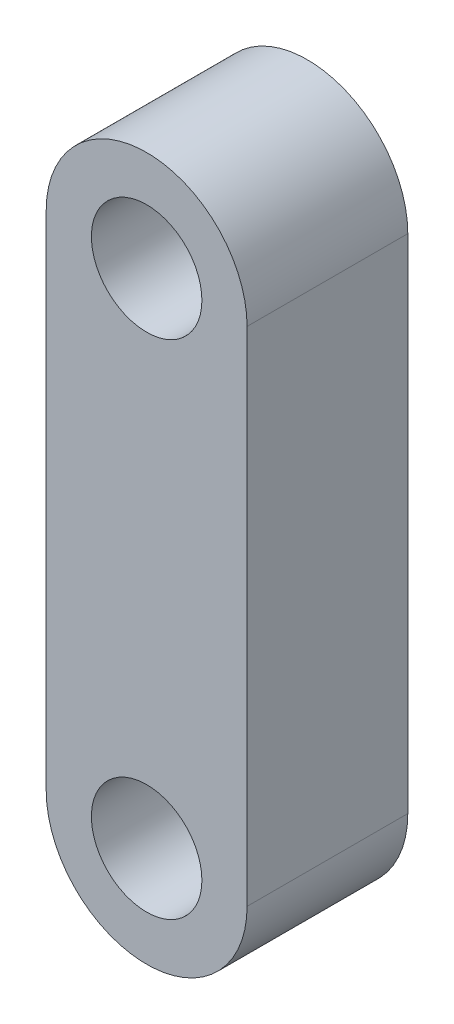
ISO-10303-21;
HEADER;
FILE_DESCRIPTION(('STEP AP214'),'2;1');
FILE_NAME('part.step','',(''),(''),'','','');
FILE_SCHEMA(('AUTOMOTIVE_DESIGN { 1 0 10303 214 1 1 1 1 }'));
ENDSEC;
DATA;
#1=APPLICATION_CONTEXT('core data for automotive mechanical design processes');
#2=APPLICATION_PROTOCOL_DEFINITION('international standard','automotive_design',2000,#1);
#3=PRODUCT_CONTEXT('',#1,'mechanical');
#4=PRODUCT('Part','Part','',(#3));
#5=PRODUCT_RELATED_PRODUCT_CATEGORY('part','',(#4));
#6=PRODUCT_DEFINITION_FORMATION('','',#4);
#7=PRODUCT_DEFINITION_CONTEXT('part definition',#1,'design');
#8=PRODUCT_DEFINITION('design','',#6,#7);
#9=PRODUCT_DEFINITION_SHAPE('','',#8);
#10=(LENGTH_UNIT() NAMED_UNIT(*) SI_UNIT(.MILLI.,.METRE.));
#11=(NAMED_UNIT(*) PLANE_ANGLE_UNIT() SI_UNIT($,.RADIAN.));
#12=(NAMED_UNIT(*) SI_UNIT($,.STERADIAN.) SOLID_ANGLE_UNIT());
#13=UNCERTAINTY_MEASURE_WITH_UNIT(LENGTH_MEASURE(1.E-05),#10,'distance_accuracy_value','');
#14=(GEOMETRIC_REPRESENTATION_CONTEXT(3) GLOBAL_UNCERTAINTY_ASSIGNED_CONTEXT((#13)) GLOBAL_UNIT_ASSIGNED_CONTEXT((#10,
#11,#12)) REPRESENTATION_CONTEXT('',''));
#15=CARTESIAN_POINT('',(0.,0.,0.));
#16=DIRECTION('',(0.,0.,1.));
#17=DIRECTION('',(1.,0.,0.));
#18=AXIS2_PLACEMENT_3D('',#15,#16,#17);
#19=CARTESIAN_POINT('',(-24.24,12.5,8.));
#20=DIRECTION('',(0.,0.,-1.));
#21=DIRECTION('',(-1.,0.,0.));
#22=AXIS2_PLACEMENT_3D('',#19,#20,#21);
#23=CYLINDRICAL_SURFACE('',#22,5.);
#24=CARTESIAN_POINT('',(-24.24,12.5,0.));
#25=DIRECTION('',(0.,0.,1.));
#26=DIRECTION('',(1.,0.,0.));
#27=AXIS2_PLACEMENT_3D('',#24,#25,#26);
#28=CIRCLE('',#27,5.);
#29=CARTESIAN_POINT('',(-19.24,12.5,0.));
#30=VERTEX_POINT('',#29);
#31=CARTESIAN_POINT('',(-29.24,12.5,0.));
#32=VERTEX_POINT('',#31);
#33=EDGE_CURVE('E113',#30,#32,#28,.T.);
#34=ORIENTED_EDGE('',*,*,#33,.T.);
#35=DIRECTION('',(0.,0.,-1.));
#36=VECTOR('',#35,1.);
#37=CARTESIAN_POINT('',(-29.24,12.5,8.));
#38=LINE('',#37,#36);
#39=CARTESIAN_POINT('',(-29.24,12.5,8.));
#40=VERTEX_POINT('',#39);
#41=EDGE_CURVE('E11',#40,#32,#38,.T.);
#42=ORIENTED_EDGE('',*,*,#41,.F.);
#43=CARTESIAN_POINT('',(-24.24,12.5,8.));
#44=DIRECTION('',(0.,0.,1.));
#45=DIRECTION('',(1.,0.,0.));
#46=AXIS2_PLACEMENT_3D('',#43,#44,#45);
#47=CIRCLE('',#46,5.);
#48=CARTESIAN_POINT('',(-19.24,12.5,8.));
#49=VERTEX_POINT('',#48);
#50=EDGE_CURVE('E97',#49,#40,#47,.T.);
#51=ORIENTED_EDGE('',*,*,#50,.F.);
#52=DIRECTION('',(0.,0.,-1.));
#53=VECTOR('',#52,1.);
#54=CARTESIAN_POINT('',(-19.24,12.5,8.));
#55=LINE('',#54,#53);
#56=EDGE_CURVE('E109',#49,#30,#55,.T.);
#57=ORIENTED_EDGE('',*,*,#56,.T.);
#58=EDGE_LOOP('',(#34,#42,#51,#57));
#59=FACE_BOUND('',#58,.T.);
#60=ADVANCED_FACE('F45',(#59),#23,.T.);
#61=CARTESIAN_POINT('',(-29.24,12.5,8.));
#62=DIRECTION('',(1.,0.,0.));
#63=DIRECTION('',(0.,0.,-1.));
#64=AXIS2_PLACEMENT_3D('',#61,#62,#63);
#65=PLANE('',#64);
#66=DIRECTION('',(0.,-1.,0.));
#67=VECTOR('',#66,1.);
#68=CARTESIAN_POINT('',(-29.24,12.5,0.));
#69=LINE('',#68,#67);
#70=CARTESIAN_POINT('',(-29.24,-12.5,0.));
#71=VERTEX_POINT('',#70);
#72=EDGE_CURVE('E102',#32,#71,#69,.T.);
#73=ORIENTED_EDGE('',*,*,#72,.T.);
#74=DIRECTION('',(0.,0.,-1.));
#75=VECTOR('',#74,1.);
#76=CARTESIAN_POINT('',(-29.24,-12.5,8.));
#77=LINE('',#76,#75);
#78=CARTESIAN_POINT('',(-29.24,-12.5,8.));
#79=VERTEX_POINT('',#78);
#80=EDGE_CURVE('E54',#79,#71,#77,.T.);
#81=ORIENTED_EDGE('',*,*,#80,.F.);
#82=DIRECTION('',(0.,-1.,0.));
#83=VECTOR('',#82,1.);
#84=CARTESIAN_POINT('',(-29.24,12.5,8.));
#85=LINE('',#84,#83);
#86=EDGE_CURVE('E92',#40,#79,#85,.T.);
#87=ORIENTED_EDGE('',*,*,#86,.F.);
#88=ORIENTED_EDGE('',*,*,#41,.T.);
#89=EDGE_LOOP('',(#73,#81,#87,#88));
#90=FACE_BOUND('',#89,.T.);
#91=ADVANCED_FACE('F101',(#90),#65,.F.);
#92=CARTESIAN_POINT('',(-24.24,-12.5,8.));
#93=DIRECTION('',(0.,0.,-1.));
#94=DIRECTION('',(-1.,0.,0.));
#95=AXIS2_PLACEMENT_3D('',#92,#93,#94);
#96=CYLINDRICAL_SURFACE('',#95,5.);
#97=CARTESIAN_POINT('',(-24.24,-12.5,0.));
#98=DIRECTION('',(0.,0.,1.));
#99=DIRECTION('',(1.,0.,0.));
#100=AXIS2_PLACEMENT_3D('',#97,#98,#99);
#101=CIRCLE('',#100,5.);
#102=CARTESIAN_POINT('',(-19.24,-12.5,0.));
#103=VERTEX_POINT('',#102);
#104=EDGE_CURVE('E79',#71,#103,#101,.T.);
#105=ORIENTED_EDGE('',*,*,#104,.T.);
#106=DIRECTION('',(0.,0.,-1.));
#107=VECTOR('',#106,1.);
#108=CARTESIAN_POINT('',(-19.24,-12.5,8.));
#109=LINE('',#108,#107);
#110=CARTESIAN_POINT('',(-19.24,-12.5,8.));
#111=VERTEX_POINT('',#110);
#112=EDGE_CURVE('E104',#111,#103,#109,.T.);
#113=ORIENTED_EDGE('',*,*,#112,.F.);
#114=CARTESIAN_POINT('',(-24.24,-12.5,8.));
#115=DIRECTION('',(0.,0.,1.));
#116=DIRECTION('',(1.,0.,0.));
#117=AXIS2_PLACEMENT_3D('',#114,#115,#116);
#118=CIRCLE('',#117,5.);
#119=EDGE_CURVE('E95',#79,#111,#118,.T.);
#120=ORIENTED_EDGE('',*,*,#119,.F.);
#121=ORIENTED_EDGE('',*,*,#80,.T.);
#122=EDGE_LOOP('',(#105,#113,#120,#121));
#123=FACE_BOUND('',#122,.T.);
#124=ADVANCED_FACE('F105',(#123),#96,.T.);
#125=CARTESIAN_POINT('',(-19.24,-12.5,8.));
#126=DIRECTION('',(-1.,0.,0.));
#127=DIRECTION('',(0.,0.,1.));
#128=AXIS2_PLACEMENT_3D('',#125,#126,#127);
#129=PLANE('',#128);
#130=DIRECTION('',(0.,1.,0.));
#131=VECTOR('',#130,1.);
#132=CARTESIAN_POINT('',(-19.24,-12.5,0.));
#133=LINE('',#132,#131);
#134=EDGE_CURVE('E85',#103,#30,#133,.T.);
#135=ORIENTED_EDGE('',*,*,#134,.T.);
#136=ORIENTED_EDGE('',*,*,#56,.F.);
#137=DIRECTION('',(0.,1.,0.));
#138=VECTOR('',#137,1.);
#139=CARTESIAN_POINT('',(-19.24,-12.5,8.));
#140=LINE('',#139,#138);
#141=EDGE_CURVE('E62',#111,#49,#140,.T.);
#142=ORIENTED_EDGE('',*,*,#141,.F.);
#143=ORIENTED_EDGE('',*,*,#112,.T.);
#144=EDGE_LOOP('',(#135,#136,#142,#143));
#145=FACE_BOUND('',#144,.T.);
#146=ADVANCED_FACE('F127',(#145),#129,.F.);
#147=CARTESIAN_POINT('',(-24.24,12.5,8.));
#148=DIRECTION('',(0.,0.,1.));
#149=DIRECTION('',(1.,0.,0.));
#150=AXIS2_PLACEMENT_3D('',#147,#148,#149);
#151=PLANE('',#150);
#152=CARTESIAN_POINT('',(-24.24,-12.5,8.));
#153=DIRECTION('',(0.,0.,1.));
#154=DIRECTION('',(1.,0.,0.));
#155=AXIS2_PLACEMENT_3D('',#152,#153,#154);
#156=CIRCLE('',#155,2.75);
#157=CARTESIAN_POINT('',(-21.49,-12.5,8.));
#158=VERTEX_POINT('',#157);
#159=EDGE_CURVE('E145',#158,#158,#156,.T.);
#160=ORIENTED_EDGE('',*,*,#159,.F.);
#161=EDGE_LOOP('',(#160));
#162=FACE_BOUND('',#161,.T.);
#163=CARTESIAN_POINT('',(-24.24,12.5,8.));
#164=DIRECTION('',(0.,0.,1.));
#165=DIRECTION('',(1.,0.,0.));
#166=AXIS2_PLACEMENT_3D('',#163,#164,#165);
#167=CIRCLE('',#166,2.75);
#168=CARTESIAN_POINT('',(-21.49,12.5,8.));
#169=VERTEX_POINT('',#168);
#170=EDGE_CURVE('E137',#169,#169,#167,.T.);
#171=ORIENTED_EDGE('',*,*,#170,.F.);
#172=EDGE_LOOP('',(#171));
#173=FACE_BOUND('',#172,.T.);
#174=ORIENTED_EDGE('',*,*,#50,.T.);
#175=ORIENTED_EDGE('',*,*,#86,.T.);
#176=ORIENTED_EDGE('',*,*,#119,.T.);
#177=ORIENTED_EDGE('',*,*,#141,.T.);
#178=EDGE_LOOP('',(#174,#175,#176,#177));
#179=FACE_BOUND('',#178,.T.);
#180=ADVANCED_FACE('F93',(#162,#173,#179),#151,.T.);
#181=CARTESIAN_POINT('',(-24.24,12.5,0.));
#182=DIRECTION('',(0.,0.,1.));
#183=DIRECTION('',(1.,0.,0.));
#184=AXIS2_PLACEMENT_3D('',#181,#182,#183);
#185=PLANE('',#184);
#186=CARTESIAN_POINT('',(-24.24,-12.5,0.));
#187=DIRECTION('',(0.,0.,1.));
#188=DIRECTION('',(1.,0.,0.));
#189=AXIS2_PLACEMENT_3D('',#186,#187,#188);
#190=CIRCLE('',#189,2.75);
#191=CARTESIAN_POINT('',(-21.49,-12.5,0.));
#192=VERTEX_POINT('',#191);
#193=EDGE_CURVE('E141',#192,#192,#190,.T.);
#194=ORIENTED_EDGE('',*,*,#193,.T.);
#195=EDGE_LOOP('',(#194));
#196=FACE_BOUND('',#195,.T.);
#197=CARTESIAN_POINT('',(-24.24,12.5,0.));
#198=DIRECTION('',(0.,0.,1.));
#199=DIRECTION('',(1.,0.,0.));
#200=AXIS2_PLACEMENT_3D('',#197,#198,#199);
#201=CIRCLE('',#200,2.75);
#202=CARTESIAN_POINT('',(-21.49,12.5,0.));
#203=VERTEX_POINT('',#202);
#204=EDGE_CURVE('E117',#203,#203,#201,.T.);
#205=ORIENTED_EDGE('',*,*,#204,.T.);
#206=EDGE_LOOP('',(#205));
#207=FACE_BOUND('',#206,.T.);
#208=ORIENTED_EDGE('',*,*,#33,.F.);
#209=ORIENTED_EDGE('',*,*,#134,.F.);
#210=ORIENTED_EDGE('',*,*,#104,.F.);
#211=ORIENTED_EDGE('',*,*,#72,.F.);
#212=EDGE_LOOP('',(#208,#209,#210,#211));
#213=FACE_BOUND('',#212,.T.);
#214=ADVANCED_FACE('F130',(#196,#207,#213),#185,.F.);
#215=CARTESIAN_POINT('',(-24.24,12.5,8.));
#216=DIRECTION('',(0.,0.,1.));
#217=DIRECTION('',(1.,0.,0.));
#218=AXIS2_PLACEMENT_3D('',#215,#216,#217);
#219=CYLINDRICAL_SURFACE('',#218,2.75);
#220=ORIENTED_EDGE('',*,*,#204,.F.);
#221=EDGE_LOOP('',(#220));
#222=FACE_BOUND('',#221,.T.);
#223=ORIENTED_EDGE('',*,*,#170,.T.);
#224=EDGE_LOOP('',(#223));
#225=FACE_BOUND('',#224,.T.);
#226=ADVANCED_FACE('F157',(#222,#225),#219,.F.);
#227=CARTESIAN_POINT('',(-24.24,-12.5,8.));
#228=DIRECTION('',(0.,0.,1.));
#229=DIRECTION('',(1.,0.,0.));
#230=AXIS2_PLACEMENT_3D('',#227,#228,#229);
#231=CYLINDRICAL_SURFACE('',#230,2.75);
#232=ORIENTED_EDGE('',*,*,#193,.F.);
#233=EDGE_LOOP('',(#232));
#234=FACE_BOUND('',#233,.T.);
#235=ORIENTED_EDGE('',*,*,#159,.T.);
#236=EDGE_LOOP('',(#235));
#237=FACE_BOUND('',#236,.T.);
#238=ADVANCED_FACE('F150',(#234,#237),#231,.F.);
#239=CLOSED_SHELL('',(#60,#91,#124,#146,#180,#214,#226,#238));
#240=MANIFOLD_SOLID_BREP('B2',#239);
#241=ADVANCED_BREP_SHAPE_REPRESENTATION('',(#18,#240),#14);
#242=SHAPE_DEFINITION_REPRESENTATION(#9,#241);
ENDSEC;
END-ISO-10303-21;
